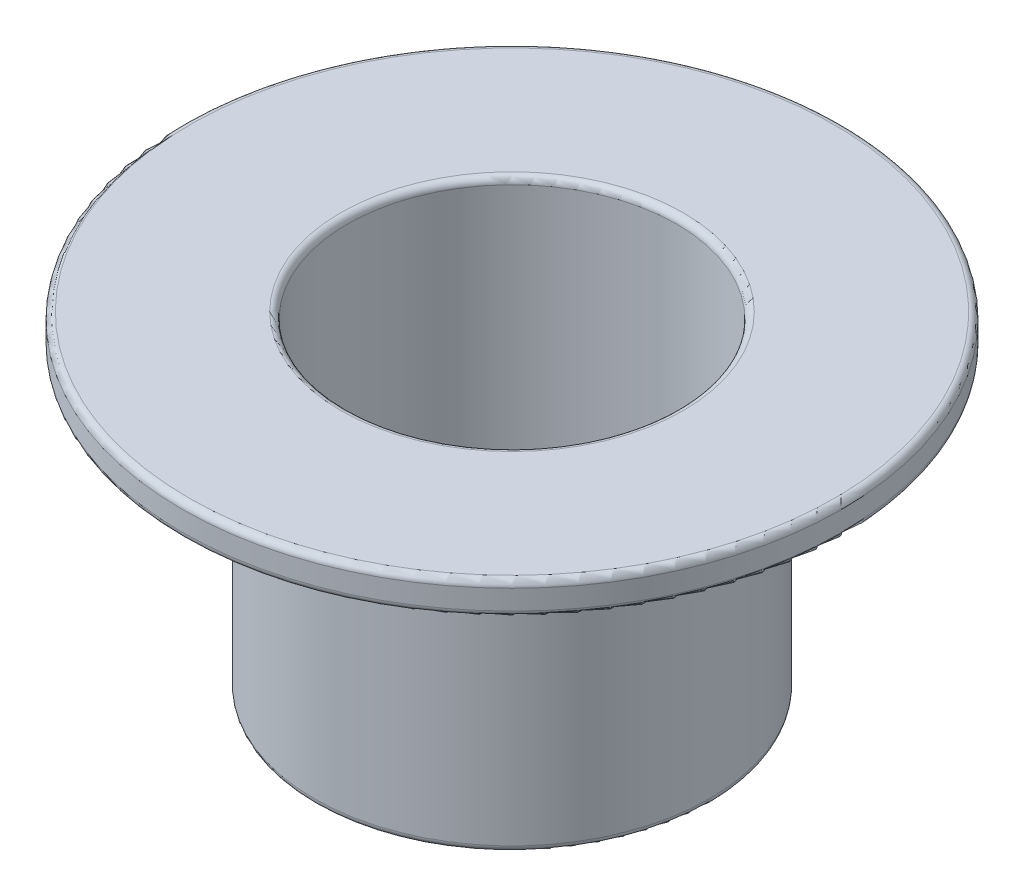
ISO-10303-21;
HEADER;
FILE_DESCRIPTION(('STEP AP214'),'2;1');
FILE_NAME('part.step','',(''),(''),'','','');
FILE_SCHEMA(('AUTOMOTIVE_DESIGN { 1 0 10303 214 1 1 1 1 }'));
ENDSEC;
DATA;
#1=APPLICATION_CONTEXT('core data for automotive mechanical design processes');
#2=APPLICATION_PROTOCOL_DEFINITION('international standard','automotive_design',2000,#1);
#3=PRODUCT_CONTEXT('',#1,'mechanical');
#4=PRODUCT('Part','Part','',(#3));
#5=PRODUCT_RELATED_PRODUCT_CATEGORY('part','',(#4));
#6=PRODUCT_DEFINITION_FORMATION('','',#4);
#7=PRODUCT_DEFINITION_CONTEXT('part definition',#1,'design');
#8=PRODUCT_DEFINITION('design','',#6,#7);
#9=PRODUCT_DEFINITION_SHAPE('','',#8);
#10=(LENGTH_UNIT() NAMED_UNIT(*) SI_UNIT(.MILLI.,.METRE.));
#11=(NAMED_UNIT(*) PLANE_ANGLE_UNIT() SI_UNIT($,.RADIAN.));
#12=(NAMED_UNIT(*) SI_UNIT($,.STERADIAN.) SOLID_ANGLE_UNIT());
#13=UNCERTAINTY_MEASURE_WITH_UNIT(LENGTH_MEASURE(1.E-05),#10,'distance_accuracy_value','');
#14=(GEOMETRIC_REPRESENTATION_CONTEXT(3) GLOBAL_UNCERTAINTY_ASSIGNED_CONTEXT((#13)) GLOBAL_UNIT_ASSIGNED_CONTEXT((#10,
#11,#12)) REPRESENTATION_CONTEXT('',''));
#15=CARTESIAN_POINT('',(0.,0.,0.));
#16=DIRECTION('',(0.,0.,1.));
#17=DIRECTION('',(1.,0.,0.));
#18=AXIS2_PLACEMENT_3D('',#15,#16,#17);
#19=CARTESIAN_POINT('',(0.,0.,0.));
#20=DIRECTION('',(0.,1.,0.));
#21=DIRECTION('',(0.,0.,1.));
#22=AXIS2_PLACEMENT_3D('',#19,#20,#21);
#23=PLANE('',#22);
#24=CARTESIAN_POINT('',(0.,0.,0.));
#25=DIRECTION('',(0.,1.,0.));
#26=DIRECTION('',(0.,0.,1.));
#27=AXIS2_PLACEMENT_3D('',#24,#25,#26);
#28=CIRCLE('',#27,2.6);
#29=CARTESIAN_POINT('',(0.,0.,2.6));
#30=VERTEX_POINT('',#29);
#31=EDGE_CURVE('E44',#30,#30,#28,.T.);
#32=ORIENTED_EDGE('',*,*,#31,.T.);
#33=EDGE_LOOP('',(#32));
#34=FACE_BOUND('',#33,.T.);
#35=CARTESIAN_POINT('',(0.,0.,0.));
#36=DIRECTION('',(0.,1.,0.));
#37=DIRECTION('',(0.,0.,1.));
#38=AXIS2_PLACEMENT_3D('',#35,#36,#37);
#39=CIRCLE('',#38,2.9);
#40=CARTESIAN_POINT('',(0.,0.,2.9));
#41=VERTEX_POINT('',#40);
#42=EDGE_CURVE('E48',#41,#41,#39,.F.);
#43=ORIENTED_EDGE('',*,*,#42,.T.);
#44=EDGE_LOOP('',(#43));
#45=FACE_BOUND('',#44,.T.);
#46=ADVANCED_FACE('F37',(#34,#45),#23,.F.);
#47=CARTESIAN_POINT('',(0.,4.5,0.));
#48=DIRECTION('',(0.,-1.,0.));
#49=DIRECTION('',(0.,0.,-1.));
#50=AXIS2_PLACEMENT_3D('',#47,#48,#49);
#51=CYLINDRICAL_SURFACE('',#50,3.);
#52=CARTESIAN_POINT('',(0.,0.1,0.));
#53=DIRECTION('',(0.,1.,0.));
#54=DIRECTION('',(0.,0.,1.));
#55=AXIS2_PLACEMENT_3D('',#52,#53,#54);
#56=CIRCLE('',#55,3.);
#57=CARTESIAN_POINT('',(0.,0.1,3.));
#58=VERTEX_POINT('',#57);
#59=EDGE_CURVE('E10',#58,#58,#56,.T.);
#60=ORIENTED_EDGE('',*,*,#59,.T.);
#61=EDGE_LOOP('',(#60));
#62=FACE_BOUND('',#61,.T.);
#63=CARTESIAN_POINT('',(0.,4.5,0.));
#64=DIRECTION('',(0.,1.,0.));
#65=DIRECTION('',(0.,0.,1.));
#66=AXIS2_PLACEMENT_3D('',#63,#64,#65);
#67=CIRCLE('',#66,3.);
#68=CARTESIAN_POINT('',(0.,4.5,3.));
#69=VERTEX_POINT('',#68);
#70=EDGE_CURVE('E75',#69,#69,#67,.T.);
#71=ORIENTED_EDGE('',*,*,#70,.F.);
#72=EDGE_LOOP('',(#71));
#73=FACE_BOUND('',#72,.T.);
#74=ADVANCED_FACE('F81',(#62,#73),#51,.T.);
#75=CARTESIAN_POINT('',(0.,4.5,0.));
#76=DIRECTION('',(0.,-1.,0.));
#77=DIRECTION('',(0.,0.,-1.));
#78=AXIS2_PLACEMENT_3D('',#75,#76,#77);
#79=CYLINDRICAL_SURFACE('',#78,2.5);
#80=CARTESIAN_POINT('',(0.,4.9,0.));
#81=DIRECTION('',(0.,1.,0.));
#82=DIRECTION('',(0.,0.,1.));
#83=AXIS2_PLACEMENT_3D('',#80,#81,#82);
#84=CIRCLE('',#83,2.5);
#85=CARTESIAN_POINT('',(0.,4.9,2.5));
#86=VERTEX_POINT('',#85);
#87=EDGE_CURVE('E69',#86,#86,#84,.T.);
#88=ORIENTED_EDGE('',*,*,#87,.T.);
#89=EDGE_LOOP('',(#88));
#90=FACE_BOUND('',#89,.T.);
#91=CARTESIAN_POINT('',(0.,0.1,0.));
#92=DIRECTION('',(0.,1.,0.));
#93=DIRECTION('',(0.,0.,1.));
#94=AXIS2_PLACEMENT_3D('',#91,#92,#93);
#95=CIRCLE('',#94,2.5);
#96=CARTESIAN_POINT('',(0.,0.1,2.5));
#97=VERTEX_POINT('',#96);
#98=EDGE_CURVE('E72',#97,#97,#95,.F.);
#99=ORIENTED_EDGE('',*,*,#98,.T.);
#100=EDGE_LOOP('',(#99));
#101=FACE_BOUND('',#100,.T.);
#102=ADVANCED_FACE('F83',(#90,#101),#79,.F.);
#103=CARTESIAN_POINT('',(0.,4.5,0.));
#104=DIRECTION('',(0.,1.,0.));
#105=DIRECTION('',(0.,0.,1.));
#106=AXIS2_PLACEMENT_3D('',#103,#104,#105);
#107=PLANE('',#106);
#108=CARTESIAN_POINT('',(0.,4.5,0.));
#109=DIRECTION('',(0.,1.,0.));
#110=DIRECTION('',(0.,0.,1.));
#111=AXIS2_PLACEMENT_3D('',#108,#109,#110);
#112=CIRCLE('',#111,4.9);
#113=CARTESIAN_POINT('',(0.,4.5,4.9));
#114=VERTEX_POINT('',#113);
#115=EDGE_CURVE('E52',#114,#114,#112,.F.);
#116=ORIENTED_EDGE('',*,*,#115,.T.);
#117=EDGE_LOOP('',(#116));
#118=FACE_BOUND('',#117,.T.);
#119=ORIENTED_EDGE('',*,*,#70,.T.);
#120=EDGE_LOOP('',(#119));
#121=FACE_BOUND('',#120,.T.);
#122=ADVANCED_FACE('F79',(#118,#121),#107,.F.);
#123=CARTESIAN_POINT('',(0.,5.,0.));
#124=DIRECTION('',(0.,1.,0.));
#125=DIRECTION('',(0.,0.,1.));
#126=AXIS2_PLACEMENT_3D('',#123,#124,#125);
#127=PLANE('',#126);
#128=CARTESIAN_POINT('',(0.,5.,0.));
#129=DIRECTION('',(0.,1.,0.));
#130=DIRECTION('',(0.,0.,1.));
#131=AXIS2_PLACEMENT_3D('',#128,#129,#130);
#132=CIRCLE('',#131,2.6);
#133=CARTESIAN_POINT('',(0.,5.,2.6));
#134=VERTEX_POINT('',#133);
#135=EDGE_CURVE('E63',#134,#134,#132,.F.);
#136=ORIENTED_EDGE('',*,*,#135,.T.);
#137=EDGE_LOOP('',(#136));
#138=FACE_BOUND('',#137,.T.);
#139=CARTESIAN_POINT('',(0.,5.,0.));
#140=DIRECTION('',(0.,1.,0.));
#141=DIRECTION('',(0.,0.,1.));
#142=AXIS2_PLACEMENT_3D('',#139,#140,#141);
#143=CIRCLE('',#142,4.9);
#144=CARTESIAN_POINT('',(0.,5.,4.9));
#145=VERTEX_POINT('',#144);
#146=EDGE_CURVE('E66',#145,#145,#143,.T.);
#147=ORIENTED_EDGE('',*,*,#146,.T.);
#148=EDGE_LOOP('',(#147));
#149=FACE_BOUND('',#148,.T.);
#150=ADVANCED_FACE('F151',(#138,#149),#127,.T.);
#151=CARTESIAN_POINT('',(0.,5.,0.));
#152=DIRECTION('',(0.,-1.,0.));
#153=DIRECTION('',(0.,0.,-1.));
#154=AXIS2_PLACEMENT_3D('',#151,#152,#153);
#155=CYLINDRICAL_SURFACE('',#154,5.);
#156=CARTESIAN_POINT('',(0.,4.9,0.));
#157=DIRECTION('',(0.,1.,0.));
#158=DIRECTION('',(0.,0.,1.));
#159=AXIS2_PLACEMENT_3D('',#156,#157,#158);
#160=CIRCLE('',#159,5.);
#161=CARTESIAN_POINT('',(0.,4.9,5.));
#162=VERTEX_POINT('',#161);
#163=EDGE_CURVE('E57',#162,#162,#160,.F.);
#164=ORIENTED_EDGE('',*,*,#163,.T.);
#165=EDGE_LOOP('',(#164));
#166=FACE_BOUND('',#165,.T.);
#167=CARTESIAN_POINT('',(0.,4.6,0.));
#168=DIRECTION('',(0.,1.,0.));
#169=DIRECTION('',(0.,0.,1.));
#170=AXIS2_PLACEMENT_3D('',#167,#168,#169);
#171=CIRCLE('',#170,5.);
#172=CARTESIAN_POINT('',(0.,4.6,5.));
#173=VERTEX_POINT('',#172);
#174=EDGE_CURVE('E60',#173,#173,#171,.T.);
#175=ORIENTED_EDGE('',*,*,#174,.T.);
#176=EDGE_LOOP('',(#175));
#177=FACE_BOUND('',#176,.T.);
#178=ADVANCED_FACE('F97',(#166,#177),#155,.T.);
#179=CARTESIAN_POINT('',(0.,4.9,0.));
#180=DIRECTION('',(0.,1.,0.));
#181=DIRECTION('',(0.,0.,1.));
#182=AXIS2_PLACEMENT_3D('',#179,#180,#181);
#183=TOROIDAL_SURFACE('',#182,2.6,0.1);
#184=ORIENTED_EDGE('',*,*,#135,.F.);
#185=EDGE_LOOP('',(#184));
#186=FACE_BOUND('',#185,.T.);
#187=ORIENTED_EDGE('',*,*,#87,.F.);
#188=EDGE_LOOP('',(#187));
#189=FACE_BOUND('',#188,.T.);
#190=ADVANCED_FACE('F93',(#186,#189),#183,.T.);
#191=CARTESIAN_POINT('',(0.,4.9,0.));
#192=DIRECTION('',(0.,1.,0.));
#193=DIRECTION('',(0.,0.,1.));
#194=AXIS2_PLACEMENT_3D('',#191,#192,#193);
#195=TOROIDAL_SURFACE('',#194,4.9,0.1);
#196=ORIENTED_EDGE('',*,*,#163,.F.);
#197=EDGE_LOOP('',(#196));
#198=FACE_BOUND('',#197,.T.);
#199=ORIENTED_EDGE('',*,*,#146,.F.);
#200=EDGE_LOOP('',(#199));
#201=FACE_BOUND('',#200,.T.);
#202=ADVANCED_FACE('F96',(#198,#201),#195,.T.);
#203=CARTESIAN_POINT('',(0.,4.6,0.));
#204=DIRECTION('',(0.,1.,0.));
#205=DIRECTION('',(0.,0.,1.));
#206=AXIS2_PLACEMENT_3D('',#203,#204,#205);
#207=TOROIDAL_SURFACE('',#206,4.9,0.1);
#208=ORIENTED_EDGE('',*,*,#115,.F.);
#209=EDGE_LOOP('',(#208));
#210=FACE_BOUND('',#209,.T.);
#211=ORIENTED_EDGE('',*,*,#174,.F.);
#212=EDGE_LOOP('',(#211));
#213=FACE_BOUND('',#212,.T.);
#214=ADVANCED_FACE('F101',(#210,#213),#207,.T.);
#215=CARTESIAN_POINT('',(0.,0.1,0.));
#216=DIRECTION('',(0.,1.,0.));
#217=DIRECTION('',(0.,0.,1.));
#218=AXIS2_PLACEMENT_3D('',#215,#216,#217);
#219=TOROIDAL_SURFACE('',#218,2.6,0.1);
#220=ORIENTED_EDGE('',*,*,#98,.F.);
#221=EDGE_LOOP('',(#220));
#222=FACE_BOUND('',#221,.T.);
#223=ORIENTED_EDGE('',*,*,#31,.F.);
#224=EDGE_LOOP('',(#223));
#225=FACE_BOUND('',#224,.T.);
#226=ADVANCED_FACE('F104',(#222,#225),#219,.T.);
#227=CARTESIAN_POINT('',(0.,0.1,0.));
#228=DIRECTION('',(0.,1.,0.));
#229=DIRECTION('',(0.,0.,1.));
#230=AXIS2_PLACEMENT_3D('',#227,#228,#229);
#231=TOROIDAL_SURFACE('',#230,2.9,0.1);
#232=ORIENTED_EDGE('',*,*,#42,.F.);
#233=EDGE_LOOP('',(#232));
#234=FACE_BOUND('',#233,.T.);
#235=ORIENTED_EDGE('',*,*,#59,.F.);
#236=EDGE_LOOP('',(#235));
#237=FACE_BOUND('',#236,.T.);
#238=ADVANCED_FACE('F39',(#234,#237),#231,.T.);
#239=CLOSED_SHELL('',(#46,#74,#102,#122,#150,#178,#190,#202,#214,#226,#238));
#240=MANIFOLD_SOLID_BREP('B2',#239);
#241=ADVANCED_BREP_SHAPE_REPRESENTATION('',(#18,#240),#14);
#242=SHAPE_DEFINITION_REPRESENTATION(#9,#241);
ENDSEC;
END-ISO-10303-21;
